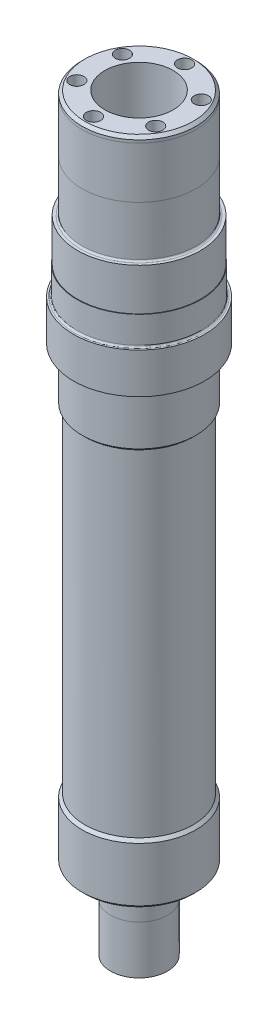
ISO-10303-21;
HEADER;
FILE_DESCRIPTION(('STEP AP214'),'2;1');
FILE_NAME('part.step','',(''),(''),'','','');
FILE_SCHEMA(('AUTOMOTIVE_DESIGN { 1 0 10303 214 1 1 1 1 }'));
ENDSEC;
DATA;
#1=APPLICATION_CONTEXT('core data for automotive mechanical design processes');
#2=APPLICATION_PROTOCOL_DEFINITION('international standard','automotive_design',2000,#1);
#3=PRODUCT_CONTEXT('',#1,'mechanical');
#4=PRODUCT('Part','Part','',(#3));
#5=PRODUCT_RELATED_PRODUCT_CATEGORY('part','',(#4));
#6=PRODUCT_DEFINITION_FORMATION('','',#4);
#7=PRODUCT_DEFINITION_CONTEXT('part definition',#1,'design');
#8=PRODUCT_DEFINITION('design','',#6,#7);
#9=PRODUCT_DEFINITION_SHAPE('','',#8);
#10=(LENGTH_UNIT() NAMED_UNIT(*) SI_UNIT(.MILLI.,.METRE.));
#11=(NAMED_UNIT(*) PLANE_ANGLE_UNIT() SI_UNIT($,.RADIAN.));
#12=(NAMED_UNIT(*) SI_UNIT($,.STERADIAN.) SOLID_ANGLE_UNIT());
#13=UNCERTAINTY_MEASURE_WITH_UNIT(LENGTH_MEASURE(1.E-05),#10,'distance_accuracy_value','');
#14=(GEOMETRIC_REPRESENTATION_CONTEXT(3) GLOBAL_UNCERTAINTY_ASSIGNED_CONTEXT((#13)) GLOBAL_UNIT_ASSIGNED_CONTEXT((#10,
#11,#12)) REPRESENTATION_CONTEXT('',''));
#15=CARTESIAN_POINT('',(0.,0.,0.));
#16=DIRECTION('',(0.,0.,1.));
#17=DIRECTION('',(1.,0.,0.));
#18=AXIS2_PLACEMENT_3D('',#15,#16,#17);
#19=CARTESIAN_POINT('',(0.,-55.8139567527737,25.));
#20=DIRECTION('',(0.,-1.,0.));
#21=DIRECTION('',(0.,0.,-1.));
#22=AXIS2_PLACEMENT_3D('',#19,#20,#21);
#23=CYLINDRICAL_SURFACE('',#22,5.00000000000052);
#24=CARTESIAN_POINT('',(0.,-33.9,25.));
#25=DIRECTION('',(0.,-1.,0.));
#26=DIRECTION('',(0.,0.,-1.));
#27=AXIS2_PLACEMENT_3D('',#24,#25,#26);
#28=CIRCLE('',#27,5.00000000000052);
#29=CARTESIAN_POINT('',(0.,-33.9,19.9999999999995));
#30=VERTEX_POINT('',#29);
#31=EDGE_CURVE('E325',#30,#30,#28,.T.);
#32=ORIENTED_EDGE('',*,*,#31,.T.);
#33=EDGE_LOOP('',(#32));
#34=FACE_BOUND('',#33,.T.);
#35=CARTESIAN_POINT('',(0.,-39.,25.));
#36=DIRECTION('',(0.,-1.,0.));
#37=DIRECTION('',(0.,0.,-1.));
#38=AXIS2_PLACEMENT_3D('',#35,#36,#37);
#39=CIRCLE('',#38,5.00000000000052);
#40=CARTESIAN_POINT('',(1.,-39.,29.8989794855669));
#41=VERTEX_POINT('',#40);
#42=CARTESIAN_POINT('',(0.,-39.,19.9999999999995));
#43=VERTEX_POINT('',#42);
#44=EDGE_CURVE('E306',#41,#43,#39,.F.);
#45=ORIENTED_EDGE('',*,*,#44,.T.);
#46=CARTESIAN_POINT('',(-1.,-39.,29.8989794855669));
#47=VERTEX_POINT('',#46);
#48=EDGE_CURVE('E88',#43,#47,#39,.F.);
#49=ORIENTED_EDGE('',*,*,#48,.T.);
#50=CARTESIAN_POINT('',(0.,-38.9999999999997,25.));
#51=DIRECTION('',(0.,-1.,0.));
#52=DIRECTION('',(0.,0.,-1.));
#53=AXIS2_PLACEMENT_3D('',#50,#51,#52);
#54=CIRCLE('',#53,5.00000000000052);
#55=CARTESIAN_POINT('',(0.,-39.,30.0000000000005));
#56=VERTEX_POINT('',#55);
#57=EDGE_CURVE('E305',#47,#56,#54,.F.);
#58=ORIENTED_EDGE('',*,*,#57,.T.);
#59=EDGE_CURVE('E301',#56,#41,#54,.F.);
#60=ORIENTED_EDGE('',*,*,#59,.T.);
#61=EDGE_LOOP('',(#45,#49,#58,#60));
#62=FACE_BOUND('',#61,.T.);
#63=ADVANCED_FACE('F72',(#34,#62),#23,.T.);
#64=CARTESIAN_POINT('',(0.,-55.8139567527737,25.));
#65=DIRECTION('',(0.,-1.,0.));
#66=DIRECTION('',(0.,0.,-1.));
#67=AXIS2_PLACEMENT_3D('',#64,#65,#66);
#68=CYLINDRICAL_SURFACE('',#67,10.0000000000005);
#69=CARTESIAN_POINT('',(0.,65.3,25.));
#70=DIRECTION('',(0.,1.,0.));
#71=DIRECTION('',(0.,0.,1.));
#72=AXIS2_PLACEMENT_3D('',#69,#70,#71);
#73=CIRCLE('',#72,10.0000000000005);
#74=CARTESIAN_POINT('',(0.,65.3,35.0000000000005));
#75=VERTEX_POINT('',#74);
#76=EDGE_CURVE('E353',#75,#75,#73,.T.);
#77=ORIENTED_EDGE('',*,*,#76,.T.);
#78=EDGE_LOOP('',(#77));
#79=FACE_BOUND('',#78,.T.);
#80=CARTESIAN_POINT('',(0.,74.,25.));
#81=DIRECTION('',(0.,1.,0.));
#82=DIRECTION('',(0.,0.,1.));
#83=AXIS2_PLACEMENT_3D('',#80,#81,#82);
#84=CIRCLE('',#83,10.0000000000005);
#85=CARTESIAN_POINT('',(0.,74.,15.));
#86=VERTEX_POINT('',#85);
#87=CARTESIAN_POINT('',(0.,74.,35.));
#88=VERTEX_POINT('',#87);
#89=EDGE_CURVE('E296',#86,#88,#84,.F.);
#90=ORIENTED_EDGE('',*,*,#89,.T.);
#91=EDGE_CURVE('E300',#88,#86,#84,.F.);
#92=ORIENTED_EDGE('',*,*,#91,.T.);
#93=EDGE_LOOP('',(#90,#92));
#94=FACE_BOUND('',#93,.T.);
#95=ADVANCED_FACE('F375',(#79,#94),#68,.T.);
#96=ORIENTED_EDGE('',*,*,#91,.F.);
#97=ORIENTED_EDGE('',*,*,#89,.F.);
#98=EDGE_LOOP('',(#96,#97));
#99=FACE_BOUND('',#98,.T.);
#100=CARTESIAN_POINT('',(0.,83.,25.));
#101=DIRECTION('',(0.,1.,0.));
#102=DIRECTION('',(0.,0.,1.));
#103=AXIS2_PLACEMENT_3D('',#100,#101,#102);
#104=CIRCLE('',#103,10.0000000000005);
#105=CARTESIAN_POINT('',(0.,83.,15.));
#106=VERTEX_POINT('',#105);
#107=CARTESIAN_POINT('',(0.,83.,35.));
#108=VERTEX_POINT('',#107);
#109=EDGE_CURVE('E291',#106,#108,#104,.F.);
#110=ORIENTED_EDGE('',*,*,#109,.T.);
#111=EDGE_CURVE('E295',#108,#106,#104,.F.);
#112=ORIENTED_EDGE('',*,*,#111,.T.);
#113=EDGE_LOOP('',(#110,#112));
#114=FACE_BOUND('',#113,.T.);
#115=ADVANCED_FACE('F384',(#99,#114),#68,.T.);
#116=CARTESIAN_POINT('',(0.,65.,14.9999999999995));
#117=DIRECTION('',(0.,1.,0.));
#118=DIRECTION('',(0.,0.,1.));
#119=AXIS2_PLACEMENT_3D('',#116,#117,#118);
#120=PLANE('',#119);
#121=CARTESIAN_POINT('',(0.,65.,25.));
#122=DIRECTION('',(0.,1.,0.));
#123=DIRECTION('',(0.,0.,1.));
#124=AXIS2_PLACEMENT_3D('',#121,#122,#123);
#125=CIRCLE('',#124,10.3000000000005);
#126=CARTESIAN_POINT('',(0.,65.,35.3000000000005));
#127=VERTEX_POINT('',#126);
#128=EDGE_CURVE('E349',#127,#127,#125,.F.);
#129=ORIENTED_EDGE('',*,*,#128,.T.);
#130=EDGE_LOOP('',(#129));
#131=FACE_BOUND('',#130,.T.);
#132=CARTESIAN_POINT('',(0.,65.,25.));
#133=DIRECTION('',(0.,-1.,0.));
#134=DIRECTION('',(0.,0.,-1.));
#135=AXIS2_PLACEMENT_3D('',#132,#133,#134);
#136=CIRCLE('',#135,10.8000000000005);
#137=CARTESIAN_POINT('',(0.,65.,14.1999999999995));
#138=VERTEX_POINT('',#137);
#139=EDGE_CURVE('E287',#138,#138,#136,.T.);
#140=ORIENTED_EDGE('',*,*,#139,.F.);
#141=EDGE_LOOP('',(#140));
#142=FACE_BOUND('',#141,.T.);
#143=ADVANCED_FACE('F439',(#131,#142),#120,.T.);
#144=CARTESIAN_POINT('',(0.,-55.8139567527737,25.));
#145=DIRECTION('',(0.,-1.,0.));
#146=DIRECTION('',(0.,0.,-1.));
#147=AXIS2_PLACEMENT_3D('',#144,#145,#146);
#148=CYLINDRICAL_SURFACE('',#147,10.8000000000005);
#149=ORIENTED_EDGE('',*,*,#139,.T.);
#150=EDGE_LOOP('',(#149));
#151=FACE_BOUND('',#150,.T.);
#152=CARTESIAN_POINT('',(0.,57.6,25.));
#153=DIRECTION('',(0.,-1.,0.));
#154=DIRECTION('',(0.,0.,-1.));
#155=AXIS2_PLACEMENT_3D('',#152,#153,#154);
#156=CIRCLE('',#155,10.8000000000005);
#157=CARTESIAN_POINT('',(0.,57.6,14.1999999999995));
#158=VERTEX_POINT('',#157);
#159=EDGE_CURVE('E283',#158,#158,#156,.T.);
#160=ORIENTED_EDGE('',*,*,#159,.F.);
#161=EDGE_LOOP('',(#160));
#162=FACE_BOUND('',#161,.T.);
#163=ADVANCED_FACE('F435',(#151,#162),#148,.T.);
#164=CARTESIAN_POINT('',(0.,57.6,14.1999999999995));
#165=DIRECTION('',(0.,1.,0.));
#166=DIRECTION('',(0.,0.,1.));
#167=AXIS2_PLACEMENT_3D('',#164,#165,#166);
#168=PLANE('',#167);
#169=ORIENTED_EDGE('',*,*,#159,.T.);
#170=EDGE_LOOP('',(#169));
#171=FACE_BOUND('',#170,.T.);
#172=CARTESIAN_POINT('',(0.,57.6,25.));
#173=DIRECTION('',(0.,-1.,0.));
#174=DIRECTION('',(0.,0.,-1.));
#175=AXIS2_PLACEMENT_3D('',#172,#173,#174);
#176=CIRCLE('',#175,10.9000000000005);
#177=CARTESIAN_POINT('',(0.,57.6,14.0999999999995));
#178=VERTEX_POINT('',#177);
#179=EDGE_CURVE('E279',#178,#178,#176,.T.);
#180=ORIENTED_EDGE('',*,*,#179,.F.);
#181=EDGE_LOOP('',(#180));
#182=FACE_BOUND('',#181,.T.);
#183=ADVANCED_FACE('F431',(#171,#182),#168,.T.);
#184=CARTESIAN_POINT('',(0.,-55.8139567527737,25.));
#185=DIRECTION('',(0.,-1.,0.));
#186=DIRECTION('',(0.,0.,-1.));
#187=AXIS2_PLACEMENT_3D('',#184,#185,#186);
#188=CYLINDRICAL_SURFACE('',#187,10.9000000000005);
#189=CARTESIAN_POINT('',(0.,52.9,25.));
#190=DIRECTION('',(0.,1.,0.));
#191=DIRECTION('',(0.,0.,1.));
#192=AXIS2_PLACEMENT_3D('',#189,#190,#191);
#193=CIRCLE('',#192,10.9000000000005);
#194=CARTESIAN_POINT('',(0.,52.9,35.9000000000005));
#195=VERTEX_POINT('',#194);
#196=EDGE_CURVE('E14',#195,#195,#193,.T.);
#197=ORIENTED_EDGE('',*,*,#196,.T.);
#198=EDGE_LOOP('',(#197));
#199=FACE_BOUND('',#198,.T.);
#200=ORIENTED_EDGE('',*,*,#179,.T.);
#201=EDGE_LOOP('',(#200));
#202=FACE_BOUND('',#201,.T.);
#203=ADVANCED_FACE('F428',(#199,#202),#188,.T.);
#204=CARTESIAN_POINT('',(0.,52.6,13.5));
#205=DIRECTION('',(0.,1.,0.));
#206=DIRECTION('',(0.,0.,1.));
#207=AXIS2_PLACEMENT_3D('',#204,#205,#206);
#208=PLANE('',#207);
#209=CARTESIAN_POINT('',(0.,52.6,25.));
#210=DIRECTION('',(0.,1.,0.));
#211=DIRECTION('',(0.,0.,1.));
#212=AXIS2_PLACEMENT_3D('',#209,#210,#211);
#213=CIRCLE('',#212,11.2000000000005);
#214=CARTESIAN_POINT('',(0.,52.6,36.2000000000005));
#215=VERTEX_POINT('',#214);
#216=EDGE_CURVE('E81',#215,#215,#213,.F.);
#217=ORIENTED_EDGE('',*,*,#216,.T.);
#218=EDGE_LOOP('',(#217));
#219=FACE_BOUND('',#218,.T.);
#220=CARTESIAN_POINT('',(0.,52.6,25.));
#221=DIRECTION('',(0.,-1.,0.));
#222=DIRECTION('',(0.,0.,-1.));
#223=AXIS2_PLACEMENT_3D('',#220,#221,#222);
#224=CIRCLE('',#223,11.5);
#225=CARTESIAN_POINT('',(0.,52.6,13.5));
#226=VERTEX_POINT('',#225);
#227=EDGE_CURVE('E275',#226,#226,#224,.T.);
#228=ORIENTED_EDGE('',*,*,#227,.F.);
#229=EDGE_LOOP('',(#228));
#230=FACE_BOUND('',#229,.T.);
#231=ADVANCED_FACE('F361',(#219,#230),#208,.T.);
#232=CARTESIAN_POINT('',(0.,-55.8139567527737,25.));
#233=DIRECTION('',(0.,-1.,0.));
#234=DIRECTION('',(0.,0.,-1.));
#235=AXIS2_PLACEMENT_3D('',#232,#233,#234);
#236=CYLINDRICAL_SURFACE('',#235,11.5);
#237=ORIENTED_EDGE('',*,*,#227,.T.);
#238=EDGE_LOOP('',(#237));
#239=FACE_BOUND('',#238,.T.);
#240=CARTESIAN_POINT('',(0.,45.5,25.));
#241=DIRECTION('',(0.,-1.,0.));
#242=DIRECTION('',(0.,0.,-1.));
#243=AXIS2_PLACEMENT_3D('',#240,#241,#242);
#244=CIRCLE('',#243,11.5);
#245=CARTESIAN_POINT('',(0.,45.5,13.5));
#246=VERTEX_POINT('',#245);
#247=EDGE_CURVE('E271',#246,#246,#244,.T.);
#248=ORIENTED_EDGE('',*,*,#247,.F.);
#249=EDGE_LOOP('',(#248));
#250=FACE_BOUND('',#249,.T.);
#251=ADVANCED_FACE('F422',(#239,#250),#236,.T.);
#252=CARTESIAN_POINT('',(0.,45.5,13.5));
#253=DIRECTION('',(0.,-1.,0.));
#254=DIRECTION('',(0.,0.,-1.));
#255=AXIS2_PLACEMENT_3D('',#252,#253,#254);
#256=PLANE('',#255);
#257=CARTESIAN_POINT('',(0.,45.5,25.));
#258=DIRECTION('',(0.,-1.,0.));
#259=DIRECTION('',(0.,0.,-1.));
#260=AXIS2_PLACEMENT_3D('',#257,#258,#259);
#261=CIRCLE('',#260,10.3);
#262=CARTESIAN_POINT('',(0.,45.5,14.7));
#263=VERTEX_POINT('',#262);
#264=EDGE_CURVE('E345',#263,#263,#261,.F.);
#265=ORIENTED_EDGE('',*,*,#264,.T.);
#266=EDGE_LOOP('',(#265));
#267=FACE_BOUND('',#266,.T.);
#268=ORIENTED_EDGE('',*,*,#247,.T.);
#269=EDGE_LOOP('',(#268));
#270=FACE_BOUND('',#269,.T.);
#271=ADVANCED_FACE('F418',(#267,#270),#256,.T.);
#272=CARTESIAN_POINT('',(0.,-55.8139567527737,25.));
#273=DIRECTION('',(0.,-1.,0.));
#274=DIRECTION('',(0.,0.,-1.));
#275=AXIS2_PLACEMENT_3D('',#272,#273,#274);
#276=CYLINDRICAL_SURFACE('',#275,10.);
#277=CARTESIAN_POINT('',(0.,45.2,25.));
#278=DIRECTION('',(0.,-1.,0.));
#279=DIRECTION('',(0.,0.,-1.));
#280=AXIS2_PLACEMENT_3D('',#277,#278,#279);
#281=CIRCLE('',#280,10.);
#282=CARTESIAN_POINT('',(0.,45.2,15.));
#283=VERTEX_POINT('',#282);
#284=EDGE_CURVE('E341',#283,#283,#281,.T.);
#285=ORIENTED_EDGE('',*,*,#284,.T.);
#286=EDGE_LOOP('',(#285));
#287=FACE_BOUND('',#286,.T.);
#288=CARTESIAN_POINT('',(0.,36.5,25.));
#289=DIRECTION('',(0.,-1.,0.));
#290=DIRECTION('',(0.,0.,-1.));
#291=AXIS2_PLACEMENT_3D('',#288,#289,#290);
#292=CIRCLE('',#291,10.);
#293=CARTESIAN_POINT('',(0.,36.5,15.));
#294=VERTEX_POINT('',#293);
#295=EDGE_CURVE('E267',#294,#294,#292,.T.);
#296=ORIENTED_EDGE('',*,*,#295,.F.);
#297=EDGE_LOOP('',(#296));
#298=FACE_BOUND('',#297,.T.);
#299=ADVANCED_FACE('F414',(#287,#298),#276,.T.);
#300=CARTESIAN_POINT('',(0.,-55.8139567527737,25.));
#301=DIRECTION('',(0.,-1.,0.));
#302=DIRECTION('',(0.,0.,-1.));
#303=AXIS2_PLACEMENT_3D('',#300,#301,#302);
#304=CYLINDRICAL_SURFACE('',#303,9.50000000000052);
#305=CARTESIAN_POINT('',(0.,36.,25.));
#306=DIRECTION('',(0.,-1.,0.));
#307=DIRECTION('',(0.,0.,-1.));
#308=AXIS2_PLACEMENT_3D('',#305,#306,#307);
#309=CIRCLE('',#308,9.50000000000052);
#310=CARTESIAN_POINT('',(0.,36.,15.4999999999995));
#311=VERTEX_POINT('',#310);
#312=EDGE_CURVE('E337',#311,#311,#309,.T.);
#313=ORIENTED_EDGE('',*,*,#312,.T.);
#314=EDGE_LOOP('',(#313));
#315=FACE_BOUND('',#314,.T.);
#316=CARTESIAN_POINT('',(0.,-23.0000000000001,25.));
#317=DIRECTION('',(0.,1.,0.));
#318=DIRECTION('',(0.,0.,1.));
#319=AXIS2_PLACEMENT_3D('',#316,#317,#318);
#320=CIRCLE('',#319,9.50000000000052);
#321=CARTESIAN_POINT('',(0.,-23.0000000000001,34.5000000000005));
#322=VERTEX_POINT('',#321);
#323=EDGE_CURVE('E333',#322,#322,#320,.T.);
#324=ORIENTED_EDGE('',*,*,#323,.T.);
#325=EDGE_LOOP('',(#324));
#326=FACE_BOUND('',#325,.T.);
#327=ADVANCED_FACE('F407',(#315,#326),#304,.T.);
#328=CARTESIAN_POINT('',(0.,-55.8139567527737,25.));
#329=DIRECTION('',(0.,-1.,0.));
#330=DIRECTION('',(0.,0.,-1.));
#331=AXIS2_PLACEMENT_3D('',#328,#329,#330);
#332=CYLINDRICAL_SURFACE('',#331,10.0000000000005);
#333=CARTESIAN_POINT('',(0.,-33.,25.));
#334=DIRECTION('',(0.,-1.,0.));
#335=DIRECTION('',(0.,0.,-1.));
#336=AXIS2_PLACEMENT_3D('',#333,#334,#335);
#337=CIRCLE('',#336,10.0000000000005);
#338=CARTESIAN_POINT('',(0.,-33.,14.9999999999995));
#339=VERTEX_POINT('',#338);
#340=EDGE_CURVE('E313',#339,#339,#337,.F.);
#341=ORIENTED_EDGE('',*,*,#340,.T.);
#342=EDGE_LOOP('',(#341));
#343=FACE_BOUND('',#342,.T.);
#344=CARTESIAN_POINT('',(0.,-23.5,25.));
#345=DIRECTION('',(0.,-1.,0.));
#346=DIRECTION('',(0.,0.,-1.));
#347=AXIS2_PLACEMENT_3D('',#344,#345,#346);
#348=CIRCLE('',#347,10.0000000000005);
#349=CARTESIAN_POINT('',(0.,-23.5,14.9999999999995));
#350=VERTEX_POINT('',#349);
#351=EDGE_CURVE('E263',#350,#350,#348,.T.);
#352=ORIENTED_EDGE('',*,*,#351,.T.);
#353=EDGE_LOOP('',(#352));
#354=FACE_BOUND('',#353,.T.);
#355=ADVANCED_FACE('F400',(#343,#354),#332,.T.);
#356=CARTESIAN_POINT('',(0.,-33.5,18.9999999999995));
#357=DIRECTION('',(0.,-1.,0.));
#358=DIRECTION('',(0.,0.,-1.));
#359=AXIS2_PLACEMENT_3D('',#356,#357,#358);
#360=PLANE('',#359);
#361=CARTESIAN_POINT('',(0.,-33.5,25.));
#362=DIRECTION('',(0.,-1.,0.));
#363=DIRECTION('',(0.,0.,-1.));
#364=AXIS2_PLACEMENT_3D('',#361,#362,#363);
#365=CIRCLE('',#364,5.40000000000052);
#366=CARTESIAN_POINT('',(0.,-33.5,19.5999999999995));
#367=VERTEX_POINT('',#366);
#368=EDGE_CURVE('E329',#367,#367,#365,.F.);
#369=ORIENTED_EDGE('',*,*,#368,.T.);
#370=EDGE_LOOP('',(#369));
#371=FACE_BOUND('',#370,.T.);
#372=CARTESIAN_POINT('',(0.,-33.5,25.));
#373=DIRECTION('',(0.,-1.,0.));
#374=DIRECTION('',(0.,0.,-1.));
#375=AXIS2_PLACEMENT_3D('',#372,#373,#374);
#376=CIRCLE('',#375,9.50000000000051);
#377=CARTESIAN_POINT('',(0.,-33.5,15.4999999999995));
#378=VERTEX_POINT('',#377);
#379=EDGE_CURVE('E309',#378,#378,#376,.T.);
#380=ORIENTED_EDGE('',*,*,#379,.T.);
#381=EDGE_LOOP('',(#380));
#382=FACE_BOUND('',#381,.T.);
#383=CARTESIAN_POINT('',(0.,-33.5,16.9999999999998));
#384=DIRECTION('',(0.,-1.,0.));
#385=DIRECTION('',(0.,0.,-1.));
#386=AXIS2_PLACEMENT_3D('',#383,#384,#385);
#387=CIRCLE('',#386,1.24999999999999);
#388=CARTESIAN_POINT('',(0.,-33.5,15.7499999999998));
#389=VERTEX_POINT('',#388);
#390=EDGE_CURVE('E203',#389,#389,#387,.T.);
#391=ORIENTED_EDGE('',*,*,#390,.F.);
#392=EDGE_LOOP('',(#391));
#393=FACE_BOUND('',#392,.T.);
#394=CARTESIAN_POINT('',(6.92820323027573,-33.5,20.9999999999999));
#395=DIRECTION('',(0.,-1.,0.));
#396=DIRECTION('',(0.,0.,-1.));
#397=AXIS2_PLACEMENT_3D('',#394,#395,#396);
#398=CIRCLE('',#397,1.24999999999999);
#399=CARTESIAN_POINT('',(6.92820323027573,-33.5,19.7499999999999));
#400=VERTEX_POINT('',#399);
#401=EDGE_CURVE('E211',#400,#400,#398,.T.);
#402=ORIENTED_EDGE('',*,*,#401,.F.);
#403=EDGE_LOOP('',(#402));
#404=FACE_BOUND('',#403,.T.);
#405=CARTESIAN_POINT('',(6.92820323027572,-33.5,29.0000000000001));
#406=DIRECTION('',(0.,-1.,0.));
#407=DIRECTION('',(0.,0.,-1.));
#408=AXIS2_PLACEMENT_3D('',#405,#406,#407);
#409=CIRCLE('',#408,1.24999999999999);
#410=CARTESIAN_POINT('',(6.92820323027572,-33.5,27.7500000000002));
#411=VERTEX_POINT('',#410);
#412=EDGE_CURVE('E219',#411,#411,#409,.T.);
#413=ORIENTED_EDGE('',*,*,#412,.F.);
#414=EDGE_LOOP('',(#413));
#415=FACE_BOUND('',#414,.T.);
#416=CARTESIAN_POINT('',(-6.92820323027573,-33.5,20.9999999999999));
#417=DIRECTION('',(0.,-1.,0.));
#418=DIRECTION('',(0.,0.,-1.));
#419=AXIS2_PLACEMENT_3D('',#416,#417,#418);
#420=CIRCLE('',#419,1.24999999999999);
#421=CARTESIAN_POINT('',(-6.92820323027573,-33.5,19.7499999999999));
#422=VERTEX_POINT('',#421);
#423=EDGE_CURVE('E227',#422,#422,#420,.T.);
#424=ORIENTED_EDGE('',*,*,#423,.F.);
#425=EDGE_LOOP('',(#424));
#426=FACE_BOUND('',#425,.T.);
#427=CARTESIAN_POINT('',(-6.92820323027573,-33.5,29.0000000000001));
#428=DIRECTION('',(0.,-1.,0.));
#429=DIRECTION('',(0.,0.,-1.));
#430=AXIS2_PLACEMENT_3D('',#427,#428,#429);
#431=CIRCLE('',#430,1.24999999999999);
#432=CARTESIAN_POINT('',(-6.92820323027573,-33.5,27.7500000000002));
#433=VERTEX_POINT('',#432);
#434=EDGE_CURVE('E235',#433,#433,#431,.T.);
#435=ORIENTED_EDGE('',*,*,#434,.F.);
#436=EDGE_LOOP('',(#435));
#437=FACE_BOUND('',#436,.T.);
#438=CARTESIAN_POINT('',(0.,-33.5,33.0000000000003));
#439=DIRECTION('',(0.,-1.,0.));
#440=DIRECTION('',(0.,0.,-1.));
#441=AXIS2_PLACEMENT_3D('',#438,#439,#440);
#442=CIRCLE('',#441,1.24999999999999);
#443=CARTESIAN_POINT('',(0.,-33.5,31.7500000000003));
#444=VERTEX_POINT('',#443);
#445=EDGE_CURVE('E243',#444,#444,#442,.T.);
#446=ORIENTED_EDGE('',*,*,#445,.F.);
#447=EDGE_LOOP('',(#446));
#448=FACE_BOUND('',#447,.T.);
#449=ADVANCED_FACE('F392',(#371,#382,#393,#404,#415,#426,#437,#448),#360,.T.);
#450=ORIENTED_EDGE('',*,*,#48,.F.);
#451=ORIENTED_EDGE('',*,*,#44,.F.);
#452=ORIENTED_EDGE('',*,*,#59,.F.);
#453=ORIENTED_EDGE('',*,*,#57,.F.);
#454=EDGE_LOOP('',(#450,#451,#452,#453));
#455=FACE_BOUND('',#454,.T.);
#456=CARTESIAN_POINT('',(0.,-47.5,25.));
#457=DIRECTION('',(0.,-1.,0.));
#458=DIRECTION('',(0.,0.,-1.));
#459=AXIS2_PLACEMENT_3D('',#456,#457,#458);
#460=CIRCLE('',#459,5.00000000000052);
#461=CARTESIAN_POINT('',(0.,-47.5,19.9999999999995));
#462=VERTEX_POINT('',#461);
#463=EDGE_CURVE('E259',#462,#462,#460,.T.);
#464=ORIENTED_EDGE('',*,*,#463,.F.);
#465=EDGE_LOOP('',(#464));
#466=FACE_BOUND('',#465,.T.);
#467=ADVANCED_FACE('F378',(#455,#466),#23,.T.);
#468=CARTESIAN_POINT('',(0.,-47.5,19.9999999999995));
#469=DIRECTION('',(0.,-1.,0.));
#470=DIRECTION('',(0.,0.,-1.));
#471=AXIS2_PLACEMENT_3D('',#468,#469,#470);
#472=PLANE('',#471);
#473=ORIENTED_EDGE('',*,*,#463,.T.);
#474=EDGE_LOOP('',(#473));
#475=FACE_BOUND('',#474,.T.);
#476=ADVANCED_FACE('F391',(#475),#472,.T.);
#477=CARTESIAN_POINT('',(0.,-23.5,25.));
#478=DIRECTION('',(0.,1.,0.));
#479=DIRECTION('',(0.,0.,1.));
#480=AXIS2_PLACEMENT_3D('',#477,#478,#479);
#481=PLANE('',#480);
#482=CARTESIAN_POINT('',(0.,-23.5,25.));
#483=DIRECTION('',(0.,-1.,0.));
#484=DIRECTION('',(0.,0.,-1.));
#485=AXIS2_PLACEMENT_3D('',#482,#483,#484);
#486=CIRCLE('',#485,6.00000000000052);
#487=CARTESIAN_POINT('',(0.,-23.5,18.9999999999995));
#488=VERTEX_POINT('',#487);
#489=EDGE_CURVE('E255',#488,#488,#486,.T.);
#490=ORIENTED_EDGE('',*,*,#489,.F.);
#491=EDGE_LOOP('',(#490));
#492=FACE_BOUND('',#491,.T.);
#493=ADVANCED_FACE('F398',(#492),#481,.T.);
#494=CARTESIAN_POINT('',(0.,-55.8139567527737,25.));
#495=DIRECTION('',(0.,-1.,0.));
#496=DIRECTION('',(0.,0.,-1.));
#497=AXIS2_PLACEMENT_3D('',#494,#495,#496);
#498=CYLINDRICAL_SURFACE('',#497,6.0000000000005);
#499=ORIENTED_EDGE('',*,*,#489,.T.);
#500=EDGE_LOOP('',(#499));
#501=FACE_BOUND('',#500,.T.);
#502=CARTESIAN_POINT('',(0.,84.,25.));
#503=DIRECTION('',(0.,-1.,0.));
#504=DIRECTION('',(0.,0.,-1.));
#505=AXIS2_PLACEMENT_3D('',#502,#503,#504);
#506=CIRCLE('',#505,6.0000000000005);
#507=CARTESIAN_POINT('',(0.,84.,18.9999999999995));
#508=VERTEX_POINT('',#507);
#509=EDGE_CURVE('E251',#508,#508,#506,.T.);
#510=ORIENTED_EDGE('',*,*,#509,.F.);
#511=EDGE_LOOP('',(#510));
#512=FACE_BOUND('',#511,.T.);
#513=ADVANCED_FACE('F570',(#501,#512),#498,.F.);
#514=CARTESIAN_POINT('',(0.,84.,18.9999999999995));
#515=DIRECTION('',(0.,1.,0.));
#516=DIRECTION('',(0.,0.,1.));
#517=AXIS2_PLACEMENT_3D('',#514,#515,#516);
#518=PLANE('',#517);
#519=CARTESIAN_POINT('',(0.,84.,25.));
#520=DIRECTION('',(0.,1.,0.));
#521=DIRECTION('',(0.,0.,1.));
#522=AXIS2_PLACEMENT_3D('',#519,#520,#521);
#523=CIRCLE('',#522,9.50000000000048);
#524=CARTESIAN_POINT('',(0.,84.,34.5000000000005));
#525=VERTEX_POINT('',#524);
#526=EDGE_CURVE('E321',#525,#525,#523,.T.);
#527=ORIENTED_EDGE('',*,*,#526,.T.);
#528=EDGE_LOOP('',(#527));
#529=FACE_BOUND('',#528,.T.);
#530=CARTESIAN_POINT('',(-6.92820323027594,84.,29.0000000000003));
#531=DIRECTION('',(0.,1.,0.));
#532=DIRECTION('',(0.,0.,1.));
#533=AXIS2_PLACEMENT_3D('',#530,#531,#532);
#534=CIRCLE('',#533,1.24999999999999);
#535=CARTESIAN_POINT('',(-6.92820323027594,84.,30.2500000000003));
#536=VERTEX_POINT('',#535);
#537=EDGE_CURVE('E157',#536,#536,#534,.T.);
#538=ORIENTED_EDGE('',*,*,#537,.F.);
#539=EDGE_LOOP('',(#538));
#540=FACE_BOUND('',#539,.T.);
#541=CARTESIAN_POINT('',(0.,84.,33.0000000000005));
#542=DIRECTION('',(0.,1.,0.));
#543=DIRECTION('',(0.,0.,1.));
#544=AXIS2_PLACEMENT_3D('',#541,#542,#543);
#545=CIRCLE('',#544,1.24999999999999);
#546=CARTESIAN_POINT('',(0.,84.,34.2500000000005));
#547=VERTEX_POINT('',#546);
#548=EDGE_CURVE('E156',#547,#547,#545,.T.);
#549=ORIENTED_EDGE('',*,*,#548,.F.);
#550=EDGE_LOOP('',(#549));
#551=FACE_BOUND('',#550,.T.);
#552=CARTESIAN_POINT('',(6.92820323027595,84.,29.0000000000003));
#553=DIRECTION('',(0.,1.,0.));
#554=DIRECTION('',(0.,0.,1.));
#555=AXIS2_PLACEMENT_3D('',#552,#553,#554);
#556=CIRCLE('',#555,1.24999999999999);
#557=CARTESIAN_POINT('',(6.92820323027595,84.,30.2500000000003));
#558=VERTEX_POINT('',#557);
#559=EDGE_CURVE('E171',#558,#558,#556,.T.);
#560=ORIENTED_EDGE('',*,*,#559,.F.);
#561=EDGE_LOOP('',(#560));
#562=FACE_BOUND('',#561,.T.);
#563=CARTESIAN_POINT('',(6.92820323027595,84.,20.9999999999998));
#564=DIRECTION('',(0.,1.,0.));
#565=DIRECTION('',(0.,0.,1.));
#566=AXIS2_PLACEMENT_3D('',#563,#564,#565);
#567=CIRCLE('',#566,1.24999999999999);
#568=CARTESIAN_POINT('',(6.92820323027595,84.,22.2499999999998));
#569=VERTEX_POINT('',#568);
#570=EDGE_CURVE('E179',#569,#569,#567,.T.);
#571=ORIENTED_EDGE('',*,*,#570,.F.);
#572=EDGE_LOOP('',(#571));
#573=FACE_BOUND('',#572,.T.);
#574=CARTESIAN_POINT('',(0.,84.,16.9999999999995));
#575=DIRECTION('',(0.,1.,0.));
#576=DIRECTION('',(0.,0.,1.));
#577=AXIS2_PLACEMENT_3D('',#574,#575,#576);
#578=CIRCLE('',#577,1.24999999999999);
#579=CARTESIAN_POINT('',(0.,84.,18.2499999999995));
#580=VERTEX_POINT('',#579);
#581=EDGE_CURVE('E187',#580,#580,#578,.T.);
#582=ORIENTED_EDGE('',*,*,#581,.F.);
#583=EDGE_LOOP('',(#582));
#584=FACE_BOUND('',#583,.T.);
#585=CARTESIAN_POINT('',(-6.92820323027595,84.,20.9999999999998));
#586=DIRECTION('',(0.,1.,0.));
#587=DIRECTION('',(0.,0.,1.));
#588=AXIS2_PLACEMENT_3D('',#585,#586,#587);
#589=CIRCLE('',#588,1.24999999999999);
#590=CARTESIAN_POINT('',(-6.92820323027595,84.,22.2499999999998));
#591=VERTEX_POINT('',#590);
#592=EDGE_CURVE('E195',#591,#591,#589,.T.);
#593=ORIENTED_EDGE('',*,*,#592,.F.);
#594=EDGE_LOOP('',(#593));
#595=FACE_BOUND('',#594,.T.);
#596=ORIENTED_EDGE('',*,*,#509,.T.);
#597=EDGE_LOOP('',(#596));
#598=FACE_BOUND('',#597,.T.);
#599=ADVANCED_FACE('F580',(#529,#540,#551,#562,#573,#584,#595,#598),#518,.T.);
#600=CARTESIAN_POINT('',(0.,83.5,25.));
#601=DIRECTION('',(0.,1.,0.));
#602=DIRECTION('',(0.,0.,1.));
#603=AXIS2_PLACEMENT_3D('',#600,#601,#602);
#604=CIRCLE('',#603,10.0000000000005);
#605=CARTESIAN_POINT('',(0.,83.5,35.0000000000005));
#606=VERTEX_POINT('',#605);
#607=EDGE_CURVE('E317',#606,#606,#604,.F.);
#608=ORIENTED_EDGE('',*,*,#607,.T.);
#609=EDGE_LOOP('',(#608));
#610=FACE_BOUND('',#609,.T.);
#611=ORIENTED_EDGE('',*,*,#111,.F.);
#612=ORIENTED_EDGE('',*,*,#109,.F.);
#613=EDGE_LOOP('',(#611,#612));
#614=FACE_BOUND('',#613,.T.);
#615=ADVANCED_FACE('F387',(#610,#614),#68,.T.);
#616=CARTESIAN_POINT('',(0.,-25.,33.0000000000003));
#617=DIRECTION('',(0.,-1.,0.));
#618=DIRECTION('',(0.,0.,-1.));
#619=AXIS2_PLACEMENT_3D('',#616,#617,#618);
#620=CONICAL_SURFACE('',#619,1.24999999999999,1.02974425867665);
#621=CARTESIAN_POINT('',(0.,-24.2489242262156,33.0000000000003));
#622=VERTEX_POINT('',#621);
#623=VERTEX_LOOP('',#622);
#624=FACE_BOUND('',#623,.T.);
#625=CARTESIAN_POINT('',(0.,-25.,33.0000000000003));
#626=DIRECTION('',(0.,-1.,0.));
#627=DIRECTION('',(0.,0.,-1.));
#628=AXIS2_PLACEMENT_3D('',#625,#626,#627);
#629=CIRCLE('',#628,1.24999999999999);
#630=CARTESIAN_POINT('',(0.,-25.,31.7500000000003));
#631=VERTEX_POINT('',#630);
#632=EDGE_CURVE('E247',#631,#631,#629,.T.);
#633=ORIENTED_EDGE('',*,*,#632,.T.);
#634=EDGE_LOOP('',(#633));
#635=FACE_BOUND('',#634,.T.);
#636=ADVANCED_FACE('F601',(#624,#635),#620,.F.);
#637=CARTESIAN_POINT('',(0.,-33.5,33.0000000000003));
#638=DIRECTION('',(0.,-1.,0.));
#639=DIRECTION('',(0.,0.,-1.));
#640=AXIS2_PLACEMENT_3D('',#637,#638,#639);
#641=CYLINDRICAL_SURFACE('',#640,1.24999999999999);
#642=ORIENTED_EDGE('',*,*,#632,.F.);
#643=EDGE_LOOP('',(#642));
#644=FACE_BOUND('',#643,.T.);
#645=ORIENTED_EDGE('',*,*,#445,.T.);
#646=EDGE_LOOP('',(#645));
#647=FACE_BOUND('',#646,.T.);
#648=ADVANCED_FACE('F606',(#644,#647),#641,.F.);
#649=CARTESIAN_POINT('',(-6.92820323027573,-25.,29.0000000000001));
#650=DIRECTION('',(0.,-1.,0.));
#651=DIRECTION('',(0.,0.,-1.));
#652=AXIS2_PLACEMENT_3D('',#649,#650,#651);
#653=CONICAL_SURFACE('',#652,1.24999999999999,1.02974425867665);
#654=CARTESIAN_POINT('',(-6.92820323027573,-24.2489242262156,29.0000000000001));
#655=VERTEX_POINT('',#654);
#656=VERTEX_LOOP('',#655);
#657=FACE_BOUND('',#656,.T.);
#658=CARTESIAN_POINT('',(-6.92820323027573,-25.,29.0000000000001));
#659=DIRECTION('',(0.,-1.,0.));
#660=DIRECTION('',(0.,0.,-1.));
#661=AXIS2_PLACEMENT_3D('',#658,#659,#660);
#662=CIRCLE('',#661,1.24999999999999);
#663=CARTESIAN_POINT('',(-6.92820323027573,-25.,27.7500000000002));
#664=VERTEX_POINT('',#663);
#665=EDGE_CURVE('E239',#664,#664,#662,.T.);
#666=ORIENTED_EDGE('',*,*,#665,.T.);
#667=EDGE_LOOP('',(#666));
#668=FACE_BOUND('',#667,.T.);
#669=ADVANCED_FACE('F617',(#657,#668),#653,.F.);
#670=CARTESIAN_POINT('',(-6.92820323027573,-33.5,29.0000000000001));
#671=DIRECTION('',(0.,-1.,0.));
#672=DIRECTION('',(0.,0.,-1.));
#673=AXIS2_PLACEMENT_3D('',#670,#671,#672);
#674=CYLINDRICAL_SURFACE('',#673,1.24999999999999);
#675=ORIENTED_EDGE('',*,*,#665,.F.);
#676=EDGE_LOOP('',(#675));
#677=FACE_BOUND('',#676,.T.);
#678=ORIENTED_EDGE('',*,*,#434,.T.);
#679=EDGE_LOOP('',(#678));
#680=FACE_BOUND('',#679,.T.);
#681=ADVANCED_FACE('F628',(#677,#680),#674,.F.);
#682=CARTESIAN_POINT('',(-6.92820323027573,-25.,20.9999999999999));
#683=DIRECTION('',(0.,-1.,0.));
#684=DIRECTION('',(0.,0.,-1.));
#685=AXIS2_PLACEMENT_3D('',#682,#683,#684);
#686=CONICAL_SURFACE('',#685,1.24999999999999,1.02974425867665);
#687=CARTESIAN_POINT('',(-6.92820323027573,-24.2489242262156,20.9999999999999));
#688=VERTEX_POINT('',#687);
#689=VERTEX_LOOP('',#688);
#690=FACE_BOUND('',#689,.T.);
#691=CARTESIAN_POINT('',(-6.92820323027573,-25.,20.9999999999999));
#692=DIRECTION('',(0.,-1.,0.));
#693=DIRECTION('',(0.,0.,-1.));
#694=AXIS2_PLACEMENT_3D('',#691,#692,#693);
#695=CIRCLE('',#694,1.24999999999999);
#696=CARTESIAN_POINT('',(-6.92820323027573,-25.,19.7499999999999));
#697=VERTEX_POINT('',#696);
#698=EDGE_CURVE('E231',#697,#697,#695,.T.);
#699=ORIENTED_EDGE('',*,*,#698,.T.);
#700=EDGE_LOOP('',(#699));
#701=FACE_BOUND('',#700,.T.);
#702=ADVANCED_FACE('F639',(#690,#701),#686,.F.);
#703=CARTESIAN_POINT('',(-6.92820323027573,-33.5,20.9999999999999));
#704=DIRECTION('',(0.,-1.,0.));
#705=DIRECTION('',(0.,0.,-1.));
#706=AXIS2_PLACEMENT_3D('',#703,#704,#705);
#707=CYLINDRICAL_SURFACE('',#706,1.24999999999999);
#708=ORIENTED_EDGE('',*,*,#698,.F.);
#709=EDGE_LOOP('',(#708));
#710=FACE_BOUND('',#709,.T.);
#711=ORIENTED_EDGE('',*,*,#423,.T.);
#712=EDGE_LOOP('',(#711));
#713=FACE_BOUND('',#712,.T.);
#714=ADVANCED_FACE('F650',(#710,#713),#707,.F.);
#715=CARTESIAN_POINT('',(6.92820323027572,-25.,29.0000000000001));
#716=DIRECTION('',(0.,-1.,0.));
#717=DIRECTION('',(0.,0.,-1.));
#718=AXIS2_PLACEMENT_3D('',#715,#716,#717);
#719=CONICAL_SURFACE('',#718,1.24999999999999,1.02974425867665);
#720=CARTESIAN_POINT('',(6.92820323027572,-24.2489242262156,29.0000000000001));
#721=VERTEX_POINT('',#720);
#722=VERTEX_LOOP('',#721);
#723=FACE_BOUND('',#722,.T.);
#724=CARTESIAN_POINT('',(6.92820323027572,-25.,29.0000000000001));
#725=DIRECTION('',(0.,-1.,0.));
#726=DIRECTION('',(0.,0.,-1.));
#727=AXIS2_PLACEMENT_3D('',#724,#725,#726);
#728=CIRCLE('',#727,1.24999999999999);
#729=CARTESIAN_POINT('',(6.92820323027572,-25.,27.7500000000002));
#730=VERTEX_POINT('',#729);
#731=EDGE_CURVE('E223',#730,#730,#728,.T.);
#732=ORIENTED_EDGE('',*,*,#731,.T.);
#733=EDGE_LOOP('',(#732));
#734=FACE_BOUND('',#733,.T.);
#735=ADVANCED_FACE('F661',(#723,#734),#719,.F.);
#736=CARTESIAN_POINT('',(6.92820323027572,-33.5,29.0000000000001));
#737=DIRECTION('',(0.,-1.,0.));
#738=DIRECTION('',(0.,0.,-1.));
#739=AXIS2_PLACEMENT_3D('',#736,#737,#738);
#740=CYLINDRICAL_SURFACE('',#739,1.24999999999999);
#741=ORIENTED_EDGE('',*,*,#731,.F.);
#742=EDGE_LOOP('',(#741));
#743=FACE_BOUND('',#742,.T.);
#744=ORIENTED_EDGE('',*,*,#412,.T.);
#745=EDGE_LOOP('',(#744));
#746=FACE_BOUND('',#745,.T.);
#747=ADVANCED_FACE('F672',(#743,#746),#740,.F.);
#748=CARTESIAN_POINT('',(6.92820323027573,-25.,20.9999999999999));
#749=DIRECTION('',(0.,-1.,0.));
#750=DIRECTION('',(0.,0.,-1.));
#751=AXIS2_PLACEMENT_3D('',#748,#749,#750);
#752=CONICAL_SURFACE('',#751,1.24999999999999,1.02974425867665);
#753=CARTESIAN_POINT('',(6.92820323027573,-24.2489242262156,20.9999999999999));
#754=VERTEX_POINT('',#753);
#755=VERTEX_LOOP('',#754);
#756=FACE_BOUND('',#755,.T.);
#757=CARTESIAN_POINT('',(6.92820323027573,-25.,20.9999999999999));
#758=DIRECTION('',(0.,-1.,0.));
#759=DIRECTION('',(0.,0.,-1.));
#760=AXIS2_PLACEMENT_3D('',#757,#758,#759);
#761=CIRCLE('',#760,1.24999999999999);
#762=CARTESIAN_POINT('',(6.92820323027573,-25.,19.7499999999999));
#763=VERTEX_POINT('',#762);
#764=EDGE_CURVE('E215',#763,#763,#761,.T.);
#765=ORIENTED_EDGE('',*,*,#764,.T.);
#766=EDGE_LOOP('',(#765));
#767=FACE_BOUND('',#766,.T.);
#768=ADVANCED_FACE('F683',(#756,#767),#752,.F.);
#769=CARTESIAN_POINT('',(6.92820323027573,-33.5,20.9999999999999));
#770=DIRECTION('',(0.,-1.,0.));
#771=DIRECTION('',(0.,0.,-1.));
#772=AXIS2_PLACEMENT_3D('',#769,#770,#771);
#773=CYLINDRICAL_SURFACE('',#772,1.24999999999999);
#774=ORIENTED_EDGE('',*,*,#764,.F.);
#775=EDGE_LOOP('',(#774));
#776=FACE_BOUND('',#775,.T.);
#777=ORIENTED_EDGE('',*,*,#401,.T.);
#778=EDGE_LOOP('',(#777));
#779=FACE_BOUND('',#778,.T.);
#780=ADVANCED_FACE('F694',(#776,#779),#773,.F.);
#781=CARTESIAN_POINT('',(0.,-25.,16.9999999999998));
#782=DIRECTION('',(0.,-1.,0.));
#783=DIRECTION('',(0.,0.,-1.));
#784=AXIS2_PLACEMENT_3D('',#781,#782,#783);
#785=CONICAL_SURFACE('',#784,1.24999999999999,1.02974425867665);
#786=CARTESIAN_POINT('',(0.,-24.2489242262156,16.9999999999998));
#787=VERTEX_POINT('',#786);
#788=VERTEX_LOOP('',#787);
#789=FACE_BOUND('',#788,.T.);
#790=CARTESIAN_POINT('',(0.,-25.,16.9999999999998));
#791=DIRECTION('',(0.,-1.,0.));
#792=DIRECTION('',(0.,0.,-1.));
#793=AXIS2_PLACEMENT_3D('',#790,#791,#792);
#794=CIRCLE('',#793,1.24999999999999);
#795=CARTESIAN_POINT('',(0.,-25.,15.7499999999998));
#796=VERTEX_POINT('',#795);
#797=EDGE_CURVE('E207',#796,#796,#794,.T.);
#798=ORIENTED_EDGE('',*,*,#797,.T.);
#799=EDGE_LOOP('',(#798));
#800=FACE_BOUND('',#799,.T.);
#801=ADVANCED_FACE('F705',(#789,#800),#785,.F.);
#802=CARTESIAN_POINT('',(0.,-33.5,16.9999999999998));
#803=DIRECTION('',(0.,-1.,0.));
#804=DIRECTION('',(0.,0.,-1.));
#805=AXIS2_PLACEMENT_3D('',#802,#803,#804);
#806=CYLINDRICAL_SURFACE('',#805,1.24999999999999);
#807=ORIENTED_EDGE('',*,*,#797,.F.);
#808=EDGE_LOOP('',(#807));
#809=FACE_BOUND('',#808,.T.);
#810=ORIENTED_EDGE('',*,*,#390,.T.);
#811=EDGE_LOOP('',(#810));
#812=FACE_BOUND('',#811,.T.);
#813=ADVANCED_FACE('F716',(#809,#812),#806,.F.);
#814=CARTESIAN_POINT('',(-6.92820323027595,76.5,20.9999999999998));
#815=DIRECTION('',(0.,1.,0.));
#816=DIRECTION('',(0.,0.,1.));
#817=AXIS2_PLACEMENT_3D('',#814,#815,#816);
#818=CONICAL_SURFACE('',#817,1.25,1.02974425867666);
#819=CARTESIAN_POINT('',(-6.92820323027595,75.7489242262156,20.9999999999998));
#820=VERTEX_POINT('',#819);
#821=VERTEX_LOOP('',#820);
#822=FACE_BOUND('',#821,.T.);
#823=CARTESIAN_POINT('',(-6.92820323027595,76.5,20.9999999999998));
#824=DIRECTION('',(0.,1.,0.));
#825=DIRECTION('',(0.,0.,1.));
#826=AXIS2_PLACEMENT_3D('',#823,#824,#825);
#827=CIRCLE('',#826,1.25);
#828=CARTESIAN_POINT('',(-6.92820323027595,76.5,22.2499999999998));
#829=VERTEX_POINT('',#828);
#830=EDGE_CURVE('E199',#829,#829,#827,.T.);
#831=ORIENTED_EDGE('',*,*,#830,.T.);
#832=EDGE_LOOP('',(#831));
#833=FACE_BOUND('',#832,.T.);
#834=ADVANCED_FACE('F727',(#822,#833),#818,.F.);
#835=CARTESIAN_POINT('',(-6.92820323027595,84.,20.9999999999998));
#836=DIRECTION('',(0.,1.,0.));
#837=DIRECTION('',(0.,0.,1.));
#838=AXIS2_PLACEMENT_3D('',#835,#836,#837);
#839=CYLINDRICAL_SURFACE('',#838,1.24999999999999);
#840=ORIENTED_EDGE('',*,*,#830,.F.);
#841=EDGE_LOOP('',(#840));
#842=FACE_BOUND('',#841,.T.);
#843=ORIENTED_EDGE('',*,*,#592,.T.);
#844=EDGE_LOOP('',(#843));
#845=FACE_BOUND('',#844,.T.);
#846=ADVANCED_FACE('F738',(#842,#845),#839,.F.);
#847=CARTESIAN_POINT('',(0.,76.5,16.9999999999995));
#848=DIRECTION('',(0.,1.,0.));
#849=DIRECTION('',(0.,0.,1.));
#850=AXIS2_PLACEMENT_3D('',#847,#848,#849);
#851=CONICAL_SURFACE('',#850,1.25,1.02974425867666);
#852=CARTESIAN_POINT('',(0.,75.7489242262156,16.9999999999995));
#853=VERTEX_POINT('',#852);
#854=VERTEX_LOOP('',#853);
#855=FACE_BOUND('',#854,.T.);
#856=CARTESIAN_POINT('',(0.,76.5,16.9999999999995));
#857=DIRECTION('',(0.,1.,0.));
#858=DIRECTION('',(0.,0.,1.));
#859=AXIS2_PLACEMENT_3D('',#856,#857,#858);
#860=CIRCLE('',#859,1.25);
#861=CARTESIAN_POINT('',(0.,76.5,18.2499999999995));
#862=VERTEX_POINT('',#861);
#863=EDGE_CURVE('E191',#862,#862,#860,.T.);
#864=ORIENTED_EDGE('',*,*,#863,.T.);
#865=EDGE_LOOP('',(#864));
#866=FACE_BOUND('',#865,.T.);
#867=ADVANCED_FACE('F749',(#855,#866),#851,.F.);
#868=CARTESIAN_POINT('',(0.,84.,16.9999999999995));
#869=DIRECTION('',(0.,1.,0.));
#870=DIRECTION('',(0.,0.,1.));
#871=AXIS2_PLACEMENT_3D('',#868,#869,#870);
#872=CYLINDRICAL_SURFACE('',#871,1.24999999999999);
#873=ORIENTED_EDGE('',*,*,#863,.F.);
#874=EDGE_LOOP('',(#873));
#875=FACE_BOUND('',#874,.T.);
#876=ORIENTED_EDGE('',*,*,#581,.T.);
#877=EDGE_LOOP('',(#876));
#878=FACE_BOUND('',#877,.T.);
#879=ADVANCED_FACE('F760',(#875,#878),#872,.F.);
#880=CARTESIAN_POINT('',(6.92820323027595,76.5,20.9999999999998));
#881=DIRECTION('',(0.,1.,0.));
#882=DIRECTION('',(0.,0.,1.));
#883=AXIS2_PLACEMENT_3D('',#880,#881,#882);
#884=CONICAL_SURFACE('',#883,1.25,1.02974425867666);
#885=CARTESIAN_POINT('',(6.92820323027594,75.7489242262156,20.9999999999998));
#886=VERTEX_POINT('',#885);
#887=VERTEX_LOOP('',#886);
#888=FACE_BOUND('',#887,.T.);
#889=CARTESIAN_POINT('',(6.92820323027595,76.5,20.9999999999998));
#890=DIRECTION('',(0.,1.,0.));
#891=DIRECTION('',(0.,0.,1.));
#892=AXIS2_PLACEMENT_3D('',#889,#890,#891);
#893=CIRCLE('',#892,1.25);
#894=CARTESIAN_POINT('',(6.92820323027595,76.5,22.2499999999998));
#895=VERTEX_POINT('',#894);
#896=EDGE_CURVE('E183',#895,#895,#893,.T.);
#897=ORIENTED_EDGE('',*,*,#896,.T.);
#898=EDGE_LOOP('',(#897));
#899=FACE_BOUND('',#898,.T.);
#900=ADVANCED_FACE('F771',(#888,#899),#884,.F.);
#901=CARTESIAN_POINT('',(6.92820323027595,84.,20.9999999999998));
#902=DIRECTION('',(0.,1.,0.));
#903=DIRECTION('',(0.,0.,1.));
#904=AXIS2_PLACEMENT_3D('',#901,#902,#903);
#905=CYLINDRICAL_SURFACE('',#904,1.24999999999999);
#906=ORIENTED_EDGE('',*,*,#896,.F.);
#907=EDGE_LOOP('',(#906));
#908=FACE_BOUND('',#907,.T.);
#909=ORIENTED_EDGE('',*,*,#570,.T.);
#910=EDGE_LOOP('',(#909));
#911=FACE_BOUND('',#910,.T.);
#912=ADVANCED_FACE('F782',(#908,#911),#905,.F.);
#913=CARTESIAN_POINT('',(6.92820323027595,76.5,29.0000000000003));
#914=DIRECTION('',(0.,1.,0.));
#915=DIRECTION('',(0.,0.,1.));
#916=AXIS2_PLACEMENT_3D('',#913,#914,#915);
#917=CONICAL_SURFACE('',#916,1.25,1.02974425867666);
#918=CARTESIAN_POINT('',(6.92820323027595,75.7489242262156,29.0000000000003));
#919=VERTEX_POINT('',#918);
#920=VERTEX_LOOP('',#919);
#921=FACE_BOUND('',#920,.T.);
#922=CARTESIAN_POINT('',(6.92820323027595,76.5,29.0000000000003));
#923=DIRECTION('',(0.,1.,0.));
#924=DIRECTION('',(0.,0.,1.));
#925=AXIS2_PLACEMENT_3D('',#922,#923,#924);
#926=CIRCLE('',#925,1.25);
#927=CARTESIAN_POINT('',(6.92820323027595,76.5,30.2500000000003));
#928=VERTEX_POINT('',#927);
#929=EDGE_CURVE('E175',#928,#928,#926,.T.);
#930=ORIENTED_EDGE('',*,*,#929,.T.);
#931=EDGE_LOOP('',(#930));
#932=FACE_BOUND('',#931,.T.);
#933=ADVANCED_FACE('F793',(#921,#932),#917,.F.);
#934=CARTESIAN_POINT('',(6.92820323027595,84.,29.0000000000003));
#935=DIRECTION('',(0.,1.,0.));
#936=DIRECTION('',(0.,0.,1.));
#937=AXIS2_PLACEMENT_3D('',#934,#935,#936);
#938=CYLINDRICAL_SURFACE('',#937,1.24999999999999);
#939=ORIENTED_EDGE('',*,*,#929,.F.);
#940=EDGE_LOOP('',(#939));
#941=FACE_BOUND('',#940,.T.);
#942=ORIENTED_EDGE('',*,*,#559,.T.);
#943=EDGE_LOOP('',(#942));
#944=FACE_BOUND('',#943,.T.);
#945=ADVANCED_FACE('F804',(#941,#944),#938,.F.);
#946=CARTESIAN_POINT('',(0.,76.5,33.0000000000005));
#947=DIRECTION('',(0.,1.,0.));
#948=DIRECTION('',(0.,0.,1.));
#949=AXIS2_PLACEMENT_3D('',#946,#947,#948);
#950=CONICAL_SURFACE('',#949,1.25,1.02974425867666);
#951=CARTESIAN_POINT('',(0.,75.7489242262156,33.0000000000005));
#952=VERTEX_POINT('',#951);
#953=VERTEX_LOOP('',#952);
#954=FACE_BOUND('',#953,.T.);
#955=CARTESIAN_POINT('',(0.,76.5,33.0000000000005));
#956=DIRECTION('',(0.,1.,0.));
#957=DIRECTION('',(0.,0.,1.));
#958=AXIS2_PLACEMENT_3D('',#955,#956,#957);
#959=CIRCLE('',#958,1.25);
#960=CARTESIAN_POINT('',(0.,76.5,34.2500000000005));
#961=VERTEX_POINT('',#960);
#962=EDGE_CURVE('E163',#961,#961,#959,.T.);
#963=ORIENTED_EDGE('',*,*,#962,.T.);
#964=EDGE_LOOP('',(#963));
#965=FACE_BOUND('',#964,.T.);
#966=ADVANCED_FACE('F815',(#954,#965),#950,.F.);
#967=CARTESIAN_POINT('',(0.,84.,33.0000000000005));
#968=DIRECTION('',(0.,1.,0.));
#969=DIRECTION('',(0.,0.,1.));
#970=AXIS2_PLACEMENT_3D('',#967,#968,#969);
#971=CYLINDRICAL_SURFACE('',#970,1.24999999999999);
#972=ORIENTED_EDGE('',*,*,#962,.F.);
#973=EDGE_LOOP('',(#972));
#974=FACE_BOUND('',#973,.T.);
#975=ORIENTED_EDGE('',*,*,#548,.T.);
#976=EDGE_LOOP('',(#975));
#977=FACE_BOUND('',#976,.T.);
#978=ADVANCED_FACE('F149',(#974,#977),#971,.F.);
#979=CARTESIAN_POINT('',(-6.92820323027594,76.5,29.0000000000003));
#980=DIRECTION('',(0.,1.,0.));
#981=DIRECTION('',(0.,0.,1.));
#982=AXIS2_PLACEMENT_3D('',#979,#980,#981);
#983=CONICAL_SURFACE('',#982,1.25,1.02974425867666);
#984=CARTESIAN_POINT('',(-6.92820323027595,75.7489242262156,29.0000000000003));
#985=VERTEX_POINT('',#984);
#986=VERTEX_LOOP('',#985);
#987=FACE_BOUND('',#986,.T.);
#988=CARTESIAN_POINT('',(-6.92820323027594,76.5,29.0000000000003));
#989=DIRECTION('',(0.,1.,0.));
#990=DIRECTION('',(0.,0.,1.));
#991=AXIS2_PLACEMENT_3D('',#988,#989,#990);
#992=CIRCLE('',#991,1.25);
#993=CARTESIAN_POINT('',(-6.92820323027594,76.5,30.2500000000003));
#994=VERTEX_POINT('',#993);
#995=EDGE_CURVE('E153',#994,#994,#992,.T.);
#996=ORIENTED_EDGE('',*,*,#995,.T.);
#997=EDGE_LOOP('',(#996));
#998=FACE_BOUND('',#997,.T.);
#999=ADVANCED_FACE('F145',(#987,#998),#983,.F.);
#1000=CARTESIAN_POINT('',(-6.92820323027594,84.,29.0000000000003));
#1001=DIRECTION('',(0.,1.,0.));
#1002=DIRECTION('',(0.,0.,1.));
#1003=AXIS2_PLACEMENT_3D('',#1000,#1001,#1002);
#1004=CYLINDRICAL_SURFACE('',#1003,1.24999999999999);
#1005=ORIENTED_EDGE('',*,*,#995,.F.);
#1006=EDGE_LOOP('',(#1005));
#1007=FACE_BOUND('',#1006,.T.);
#1008=ORIENTED_EDGE('',*,*,#537,.T.);
#1009=EDGE_LOOP('',(#1008));
#1010=FACE_BOUND('',#1009,.T.);
#1011=ADVANCED_FACE('F148',(#1007,#1010),#1004,.F.);
#1012=CARTESIAN_POINT('',(0.,-33.5,25.));
#1013=DIRECTION('',(0.,1.,0.));
#1014=DIRECTION('',(0.,0.,1.));
#1015=AXIS2_PLACEMENT_3D('',#1012,#1013,#1014);
#1016=CONICAL_SURFACE('',#1015,9.50000000000051,0.785398163397455);
#1017=ORIENTED_EDGE('',*,*,#340,.F.);
#1018=EDGE_LOOP('',(#1017));
#1019=FACE_BOUND('',#1018,.T.);
#1020=ORIENTED_EDGE('',*,*,#379,.F.);
#1021=EDGE_LOOP('',(#1020));
#1022=FACE_BOUND('',#1021,.T.);
#1023=ADVANCED_FACE('F445',(#1019,#1022),#1016,.T.);
#1024=CARTESIAN_POINT('',(0.,83.5,25.));
#1025=DIRECTION('',(0.,-1.,0.));
#1026=DIRECTION('',(0.,0.,-1.));
#1027=AXIS2_PLACEMENT_3D('',#1024,#1025,#1026);
#1028=CONICAL_SURFACE('',#1027,10.0000000000005,0.78539816339746);
#1029=ORIENTED_EDGE('',*,*,#526,.F.);
#1030=EDGE_LOOP('',(#1029));
#1031=FACE_BOUND('',#1030,.T.);
#1032=ORIENTED_EDGE('',*,*,#607,.F.);
#1033=EDGE_LOOP('',(#1032));
#1034=FACE_BOUND('',#1033,.T.);
#1035=ADVANCED_FACE('F451',(#1031,#1034),#1028,.T.);
#1036=CARTESIAN_POINT('',(0.,-33.9,25.));
#1037=DIRECTION('',(0.,-1.,0.));
#1038=DIRECTION('',(0.,0.,-1.));
#1039=AXIS2_PLACEMENT_3D('',#1036,#1037,#1038);
#1040=TOROIDAL_SURFACE('',#1039,5.40000000000052,0.4);
#1041=ORIENTED_EDGE('',*,*,#368,.F.);
#1042=EDGE_LOOP('',(#1041));
#1043=FACE_BOUND('',#1042,.T.);
#1044=ORIENTED_EDGE('',*,*,#31,.F.);
#1045=EDGE_LOOP('',(#1044));
#1046=FACE_BOUND('',#1045,.T.);
#1047=ADVANCED_FACE('F457',(#1043,#1046),#1040,.F.);
#1048=CARTESIAN_POINT('',(0.,36.,25.));
#1049=DIRECTION('',(0.,1.,0.));
#1050=DIRECTION('',(0.,0.,1.));
#1051=AXIS2_PLACEMENT_3D('',#1048,#1049,#1050);
#1052=CONICAL_SURFACE('',#1051,9.50000000000052,0.785398163397455);
#1053=ORIENTED_EDGE('',*,*,#295,.T.);
#1054=EDGE_LOOP('',(#1053));
#1055=FACE_BOUND('',#1054,.T.);
#1056=ORIENTED_EDGE('',*,*,#312,.F.);
#1057=EDGE_LOOP('',(#1056));
#1058=FACE_BOUND('',#1057,.T.);
#1059=ADVANCED_FACE('F460',(#1055,#1058),#1052,.T.);
#1060=CARTESIAN_POINT('',(0.,-23.5,25.));
#1061=DIRECTION('',(0.,-1.,0.));
#1062=DIRECTION('',(0.,0.,-1.));
#1063=AXIS2_PLACEMENT_3D('',#1060,#1061,#1062);
#1064=CONICAL_SURFACE('',#1063,10.0000000000005,0.785398163397455);
#1065=ORIENTED_EDGE('',*,*,#323,.F.);
#1066=EDGE_LOOP('',(#1065));
#1067=FACE_BOUND('',#1066,.T.);
#1068=ORIENTED_EDGE('',*,*,#351,.F.);
#1069=EDGE_LOOP('',(#1068));
#1070=FACE_BOUND('',#1069,.T.);
#1071=ADVANCED_FACE('F467',(#1067,#1070),#1064,.T.);
#1072=CARTESIAN_POINT('',(0.,45.2,25.));
#1073=DIRECTION('',(0.,-1.,0.));
#1074=DIRECTION('',(0.,0.,-1.));
#1075=AXIS2_PLACEMENT_3D('',#1072,#1073,#1074);
#1076=TOROIDAL_SURFACE('',#1075,10.3,0.3);
#1077=ORIENTED_EDGE('',*,*,#264,.F.);
#1078=EDGE_LOOP('',(#1077));
#1079=FACE_BOUND('',#1078,.T.);
#1080=ORIENTED_EDGE('',*,*,#284,.F.);
#1081=EDGE_LOOP('',(#1080));
#1082=FACE_BOUND('',#1081,.T.);
#1083=ADVANCED_FACE('F371',(#1079,#1082),#1076,.F.);
#1084=CARTESIAN_POINT('',(0.,65.3,25.));
#1085=DIRECTION('',(0.,1.,0.));
#1086=DIRECTION('',(0.,0.,1.));
#1087=AXIS2_PLACEMENT_3D('',#1084,#1085,#1086);
#1088=TOROIDAL_SURFACE('',#1087,10.3000000000005,0.3);
#1089=ORIENTED_EDGE('',*,*,#76,.F.);
#1090=EDGE_LOOP('',(#1089));
#1091=FACE_BOUND('',#1090,.T.);
#1092=ORIENTED_EDGE('',*,*,#128,.F.);
#1093=EDGE_LOOP('',(#1092));
#1094=FACE_BOUND('',#1093,.T.);
#1095=ADVANCED_FACE('F365',(#1091,#1094),#1088,.F.);
#1096=CARTESIAN_POINT('',(0.,52.9,25.));
#1097=DIRECTION('',(0.,1.,0.));
#1098=DIRECTION('',(0.,0.,1.));
#1099=AXIS2_PLACEMENT_3D('',#1096,#1097,#1098);
#1100=TOROIDAL_SURFACE('',#1099,11.2000000000005,0.3);
#1101=ORIENTED_EDGE('',*,*,#196,.F.);
#1102=EDGE_LOOP('',(#1101));
#1103=FACE_BOUND('',#1102,.T.);
#1104=ORIENTED_EDGE('',*,*,#216,.F.);
#1105=EDGE_LOOP('',(#1104));
#1106=FACE_BOUND('',#1105,.T.);
#1107=ADVANCED_FACE('F74',(#1103,#1106),#1100,.F.);
#1108=CLOSED_SHELL('',(#63,#95,#115,#143,#163,#183,#203,#231,#251,#271,#299,#327,#355,#449,#467,
#476,#493,#513,#599,#615,#636,#648,#669,#681,#702,#714,#735,#747,#768,#780,#801,#813,#834,#846,
#867,#879,#900,#912,#933,#945,#966,#978,#999,#1011,#1023,#1035,#1047,#1059,#1071,#1083,#1095,#1107));
#1109=MANIFOLD_SOLID_BREP('B2',#1108);
#1110=ADVANCED_BREP_SHAPE_REPRESENTATION('',(#18,#1109),#14);
#1111=SHAPE_DEFINITION_REPRESENTATION(#9,#1110);
ENDSEC;
END-ISO-10303-21;
